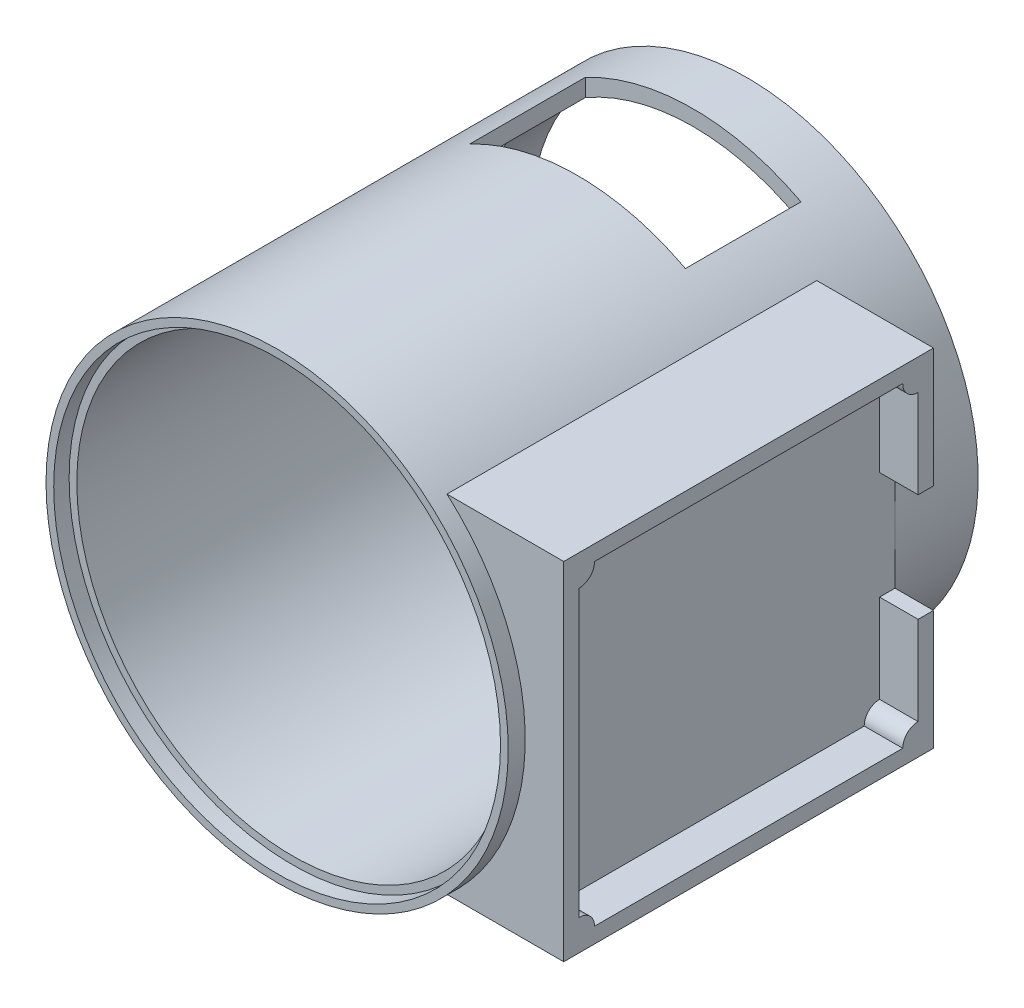
ISO-10303-21;
HEADER;
FILE_DESCRIPTION(('STEP AP214'),'2;1');
FILE_NAME('part.step','',(''),(''),'','','');
FILE_SCHEMA(('AUTOMOTIVE_DESIGN { 1 0 10303 214 1 1 1 1 }'));
ENDSEC;
DATA;
#1=APPLICATION_CONTEXT('core data for automotive mechanical design processes');
#2=APPLICATION_PROTOCOL_DEFINITION('international standard','automotive_design',2000,#1);
#3=PRODUCT_CONTEXT('',#1,'mechanical');
#4=PRODUCT('Part','Part','',(#3));
#5=PRODUCT_RELATED_PRODUCT_CATEGORY('part','',(#4));
#6=PRODUCT_DEFINITION_FORMATION('','',#4);
#7=PRODUCT_DEFINITION_CONTEXT('part definition',#1,'design');
#8=PRODUCT_DEFINITION('design','',#6,#7);
#9=PRODUCT_DEFINITION_SHAPE('','',#8);
#10=(LENGTH_UNIT() NAMED_UNIT(*) SI_UNIT(.MILLI.,.METRE.));
#11=(NAMED_UNIT(*) PLANE_ANGLE_UNIT() SI_UNIT($,.RADIAN.));
#12=(NAMED_UNIT(*) SI_UNIT($,.STERADIAN.) SOLID_ANGLE_UNIT());
#13=UNCERTAINTY_MEASURE_WITH_UNIT(LENGTH_MEASURE(1.E-05),#10,'distance_accuracy_value','');
#14=(GEOMETRIC_REPRESENTATION_CONTEXT(3) GLOBAL_UNCERTAINTY_ASSIGNED_CONTEXT((#13)) GLOBAL_UNIT_ASSIGNED_CONTEXT((#10,
#11,#12)) REPRESENTATION_CONTEXT('',''));
#15=CARTESIAN_POINT('',(0.,0.,0.));
#16=DIRECTION('',(0.,0.,1.));
#17=DIRECTION('',(1.,0.,0.));
#18=AXIS2_PLACEMENT_3D('',#15,#16,#17);
#19=CARTESIAN_POINT('',(30.,0.,0.));
#20=DIRECTION('',(1.,0.,0.));
#21=DIRECTION('',(0.,0.,-1.));
#22=AXIS2_PLACEMENT_3D('',#19,#20,#21);
#23=PLANE('',#22);
#24=DIRECTION('',(0.,-1.,0.));
#25=VECTOR('',#24,1.);
#26=CARTESIAN_POINT('',(30.,-6.99999999999999,5.794078809027));
#27=LINE('',#26,#25);
#28=CARTESIAN_POINT('',(30.,-6.99999999999999,5.794078809027));
#29=VERTEX_POINT('',#28);
#30=CARTESIAN_POINT('',(30.,-18.5,5.794078809027));
#31=VERTEX_POINT('',#30);
#32=EDGE_CURVE('E56',#29,#31,#27,.T.);
#33=ORIENTED_EDGE('',*,*,#32,.F.);
#34=DIRECTION('',(0.,0.,1.));
#35=VECTOR('',#34,1.);
#36=CARTESIAN_POINT('',(30.,-6.99999999999999,3.794078809027));
#37=LINE('',#36,#35);
#38=CARTESIAN_POINT('',(30.,-6.99999999999999,3.794078809027));
#39=VERTEX_POINT('',#38);
#40=EDGE_CURVE('E285',#39,#29,#37,.T.);
#41=ORIENTED_EDGE('',*,*,#40,.F.);
#42=DIRECTION('',(0.,1.,0.));
#43=VECTOR('',#42,1.);
#44=CARTESIAN_POINT('',(30.,22.5,3.794078809027));
#45=LINE('',#44,#43);
#46=CARTESIAN_POINT('',(30.,0.,3.794078809027));
#47=VERTEX_POINT('',#46);
#48=EDGE_CURVE('E237',#39,#47,#45,.T.);
#49=ORIENTED_EDGE('',*,*,#48,.T.);
#50=DIRECTION('',(0.,1.,0.));
#51=VECTOR('',#50,1.);
#52=CARTESIAN_POINT('',(30.,22.5,3.794078809027));
#53=LINE('',#52,#51);
#54=CARTESIAN_POINT('',(30.,7.00000000000001,3.794078809027));
#55=VERTEX_POINT('',#54);
#56=EDGE_CURVE('E400',#47,#55,#53,.T.);
#57=ORIENTED_EDGE('',*,*,#56,.T.);
#58=DIRECTION('',(0.,0.,-1.));
#59=VECTOR('',#58,1.);
#60=CARTESIAN_POINT('',(30.,7.00000000000001,3.794078809027));
#61=LINE('',#60,#59);
#62=CARTESIAN_POINT('',(30.,7.00000000000001,5.794078809027));
#63=VERTEX_POINT('',#62);
#64=EDGE_CURVE('E252',#63,#55,#61,.T.);
#65=ORIENTED_EDGE('',*,*,#64,.F.);
#66=DIRECTION('',(0.,-1.,0.));
#67=VECTOR('',#66,1.);
#68=CARTESIAN_POINT('',(30.,18.5,5.794078809027));
#69=LINE('',#68,#67);
#70=CARTESIAN_POINT('',(30.,18.5,5.794078809027));
#71=VERTEX_POINT('',#70);
#72=EDGE_CURVE('E255',#71,#63,#69,.T.);
#73=ORIENTED_EDGE('',*,*,#72,.F.);
#74=CARTESIAN_POINT('',(30.,20.5,5.794078809027));
#75=DIRECTION('',(1.,0.,0.));
#76=DIRECTION('',(0.,0.,-1.));
#77=AXIS2_PLACEMENT_3D('',#74,#75,#76);
#78=CIRCLE('',#77,1.99999999999999);
#79=CARTESIAN_POINT('',(30.,20.5,7.79407880902699));
#80=VERTEX_POINT('',#79);
#81=EDGE_CURVE('E304',#80,#71,#78,.T.);
#82=ORIENTED_EDGE('',*,*,#81,.F.);
#83=DIRECTION('',(0.,0.,-1.));
#84=VECTOR('',#83,1.);
#85=CARTESIAN_POINT('',(30.,20.5,47.794078809027));
#86=LINE('',#85,#84);
#87=CARTESIAN_POINT('',(30.,20.5,47.794078809027));
#88=VERTEX_POINT('',#87);
#89=EDGE_CURVE('E301',#88,#80,#86,.T.);
#90=ORIENTED_EDGE('',*,*,#89,.F.);
#91=CARTESIAN_POINT('',(30.,20.5,49.794078809027));
#92=DIRECTION('',(1.,0.,0.));
#93=DIRECTION('',(0.,0.,-1.));
#94=AXIS2_PLACEMENT_3D('',#91,#92,#93);
#95=CIRCLE('',#94,2.);
#96=CARTESIAN_POINT('',(30.,18.5,49.794078809027));
#97=VERTEX_POINT('',#96);
#98=EDGE_CURVE('E298',#97,#88,#95,.T.);
#99=ORIENTED_EDGE('',*,*,#98,.F.);
#100=DIRECTION('',(0.,1.,0.));
#101=VECTOR('',#100,1.);
#102=CARTESIAN_POINT('',(30.,18.5,49.794078809027));
#103=LINE('',#102,#101);
#104=CARTESIAN_POINT('',(30.,-18.5,49.794078809027));
#105=VERTEX_POINT('',#104);
#106=EDGE_CURVE('E295',#105,#97,#103,.T.);
#107=ORIENTED_EDGE('',*,*,#106,.F.);
#108=CARTESIAN_POINT('',(30.,-20.5,49.794078809027));
#109=DIRECTION('',(1.,0.,0.));
#110=DIRECTION('',(0.,0.,-1.));
#111=AXIS2_PLACEMENT_3D('',#108,#109,#110);
#112=CIRCLE('',#111,2.00000000000001);
#113=CARTESIAN_POINT('',(30.,-20.5,47.794078809027));
#114=VERTEX_POINT('',#113);
#115=EDGE_CURVE('E292',#114,#105,#112,.T.);
#116=ORIENTED_EDGE('',*,*,#115,.F.);
#117=DIRECTION('',(0.,0.,1.));
#118=VECTOR('',#117,1.);
#119=CARTESIAN_POINT('',(30.,-20.5,47.794078809027));
#120=LINE('',#119,#118);
#121=CARTESIAN_POINT('',(30.,-20.5,7.79407880902699));
#122=VERTEX_POINT('',#121);
#123=EDGE_CURVE('E289',#122,#114,#120,.T.);
#124=ORIENTED_EDGE('',*,*,#123,.F.);
#125=CARTESIAN_POINT('',(30.,-20.5,5.794078809027));
#126=DIRECTION('',(1.,0.,0.));
#127=DIRECTION('',(0.,0.,-1.));
#128=AXIS2_PLACEMENT_3D('',#125,#126,#127);
#129=CIRCLE('',#128,2.);
#130=EDGE_CURVE('E61',#31,#122,#129,.T.);
#131=ORIENTED_EDGE('',*,*,#130,.F.);
#132=EDGE_LOOP('',(#33,#41,#49,#57,#65,#73,#82,#90,#99,#107,#116,#124,#131));
#133=FACE_BOUND('',#132,.T.);
#134=ADVANCED_FACE('F41',(#133),#23,.T.);
#135=CARTESIAN_POINT('',(0.,0.,2.));
#136=DIRECTION('',(0.,0.,-1.));
#137=DIRECTION('',(-1.,0.,0.));
#138=AXIS2_PLACEMENT_3D('',#135,#136,#137);
#139=CYLINDRICAL_SURFACE('',#138,28.);
#140=DIRECTION('',(0.,0.,-1.));
#141=VECTOR('',#140,1.);
#142=CARTESIAN_POINT('',(-24.2487113059643,-13.9999999999999,2.));
#143=LINE('',#142,#141);
#144=CARTESIAN_POINT('',(-24.2487113059643,-13.9999999999999,15.));
#145=VERTEX_POINT('',#144);
#146=CARTESIAN_POINT('',(-24.2487113059643,-13.9999999999999,0.));
#147=VERTEX_POINT('',#146);
#148=EDGE_CURVE('E378',#145,#147,#143,.T.);
#149=ORIENTED_EDGE('',*,*,#148,.F.);
#150=CARTESIAN_POINT('',(0.,0.,15.));
#151=DIRECTION('',(0.,0.,1.));
#152=DIRECTION('',(0.,-1.,0.));
#153=AXIS2_PLACEMENT_3D('',#150,#151,#152);
#154=CIRCLE('',#153,28.);
#155=CARTESIAN_POINT('',(-24.2487113059642,14.0000000000001,15.));
#156=VERTEX_POINT('',#155);
#157=EDGE_CURVE('E375',#156,#145,#154,.T.);
#158=ORIENTED_EDGE('',*,*,#157,.F.);
#159=DIRECTION('',(0.,0.,-1.));
#160=VECTOR('',#159,1.);
#161=CARTESIAN_POINT('',(-24.2487113059642,14.0000000000001,2.));
#162=LINE('',#161,#160);
#163=CARTESIAN_POINT('',(-24.2487113059642,14.0000000000001,0.));
#164=VERTEX_POINT('',#163);
#165=EDGE_CURVE('E373',#164,#156,#162,.F.);
#166=ORIENTED_EDGE('',*,*,#165,.F.);
#167=CARTESIAN_POINT('',(0.,0.,0.));
#168=DIRECTION('',(0.,0.,-1.));
#169=DIRECTION('',(-1.,0.,0.));
#170=AXIS2_PLACEMENT_3D('',#167,#168,#169);
#171=CIRCLE('',#170,28.);
#172=EDGE_CURVE('E370',#147,#164,#171,.T.);
#173=ORIENTED_EDGE('',*,*,#172,.F.);
#174=EDGE_LOOP('',(#149,#158,#166,#173));
#175=FACE_BOUND('',#174,.T.);
#176=DIRECTION('',(0.,0.,-1.));
#177=VECTOR('',#176,1.);
#178=CARTESIAN_POINT('',(-14.,24.2487113059643,2.));
#179=LINE('',#178,#177);
#180=CARTESIAN_POINT('',(-14.,24.2487113059643,15.));
#181=VERTEX_POINT('',#180);
#182=CARTESIAN_POINT('',(-14.,24.2487113059643,0.));
#183=VERTEX_POINT('',#182);
#184=EDGE_CURVE('E368',#181,#183,#179,.T.);
#185=ORIENTED_EDGE('',*,*,#184,.F.);
#186=CARTESIAN_POINT('',(14.,24.2487113059643,15.));
#187=VERTEX_POINT('',#186);
#188=EDGE_CURVE('E377',#187,#181,#154,.T.);
#189=ORIENTED_EDGE('',*,*,#188,.F.);
#190=DIRECTION('',(0.,0.,-1.));
#191=VECTOR('',#190,1.);
#192=CARTESIAN_POINT('',(14.,24.2487113059643,2.));
#193=LINE('',#192,#191);
#194=CARTESIAN_POINT('',(14.,24.2487113059643,0.));
#195=VERTEX_POINT('',#194);
#196=EDGE_CURVE('E359',#195,#187,#193,.F.);
#197=ORIENTED_EDGE('',*,*,#196,.F.);
#198=EDGE_CURVE('E372',#183,#195,#171,.T.);
#199=ORIENTED_EDGE('',*,*,#198,.F.);
#200=EDGE_LOOP('',(#185,#189,#197,#199));
#201=FACE_BOUND('',#200,.T.);
#202=DIRECTION('',(0.,0.,-1.));
#203=VECTOR('',#202,1.);
#204=CARTESIAN_POINT('',(14.,-24.2487113059643,2.));
#205=LINE('',#204,#203);
#206=CARTESIAN_POINT('',(14.,-24.2487113059643,15.));
#207=VERTEX_POINT('',#206);
#208=CARTESIAN_POINT('',(14.,-24.2487113059643,0.));
#209=VERTEX_POINT('',#208);
#210=EDGE_CURVE('E398',#207,#209,#205,.T.);
#211=ORIENTED_EDGE('',*,*,#210,.F.);
#212=CARTESIAN_POINT('',(0.,0.,15.));
#213=DIRECTION('',(0.,0.,1.));
#214=DIRECTION('',(1.,0.,0.));
#215=AXIS2_PLACEMENT_3D('',#212,#213,#214);
#216=CIRCLE('',#215,28.);
#217=CARTESIAN_POINT('',(-14.,-24.2487113059643,15.));
#218=VERTEX_POINT('',#217);
#219=EDGE_CURVE('E396',#218,#207,#216,.T.);
#220=ORIENTED_EDGE('',*,*,#219,.F.);
#221=DIRECTION('',(0.,0.,-1.));
#222=VECTOR('',#221,1.);
#223=CARTESIAN_POINT('',(-14.,-24.2487113059643,2.));
#224=LINE('',#223,#222);
#225=CARTESIAN_POINT('',(-14.,-24.2487113059643,0.));
#226=VERTEX_POINT('',#225);
#227=EDGE_CURVE('E394',#226,#218,#224,.F.);
#228=ORIENTED_EDGE('',*,*,#227,.F.);
#229=CARTESIAN_POINT('',(0.,0.,0.));
#230=DIRECTION('',(0.,0.,-1.));
#231=DIRECTION('',(-1.,0.,0.));
#232=AXIS2_PLACEMENT_3D('',#229,#230,#231);
#233=CIRCLE('',#232,28.);
#234=EDGE_CURVE('E385',#209,#226,#233,.T.);
#235=ORIENTED_EDGE('',*,*,#234,.F.);
#236=EDGE_LOOP('',(#211,#220,#228,#235));
#237=FACE_BOUND('',#236,.T.);
#238=CARTESIAN_POINT('',(0.,0.,52.));
#239=DIRECTION('',(0.,0.,1.));
#240=DIRECTION('',(1.,0.,0.));
#241=AXIS2_PLACEMENT_3D('',#238,#239,#240);
#242=CIRCLE('',#241,28.);
#243=CARTESIAN_POINT('',(28.,0.,52.));
#244=VERTEX_POINT('',#243);
#245=EDGE_CURVE('E426',#244,#244,#242,.T.);
#246=ORIENTED_EDGE('',*,*,#245,.T.);
#247=EDGE_LOOP('',(#246));
#248=FACE_BOUND('',#247,.T.);
#249=CARTESIAN_POINT('',(0.,0.,-7.));
#250=DIRECTION('',(0.,0.,-1.));
#251=DIRECTION('',(-1.,0.,0.));
#252=AXIS2_PLACEMENT_3D('',#249,#250,#251);
#253=CIRCLE('',#252,28.);
#254=CARTESIAN_POINT('',(-28.,0.,-7.));
#255=VERTEX_POINT('',#254);
#256=EDGE_CURVE('E414',#255,#255,#253,.T.);
#257=ORIENTED_EDGE('',*,*,#256,.T.);
#258=EDGE_LOOP('',(#257));
#259=FACE_BOUND('',#258,.T.);
#260=ADVANCED_FACE('F479',(#175,#201,#237,#248,#259),#139,.F.);
#261=CARTESIAN_POINT('',(0.,0.,2.));
#262=DIRECTION('',(0.,0.,-1.));
#263=DIRECTION('',(-1.,0.,0.));
#264=AXIS2_PLACEMENT_3D('',#261,#262,#263);
#265=CYLINDRICAL_SURFACE('',#264,30.);
#266=DIRECTION('',(0.,0.,-1.));
#267=VECTOR('',#266,1.);
#268=CARTESIAN_POINT('',(-26.5329983228431,14.0000000000001,2.));
#269=LINE('',#268,#267);
#270=CARTESIAN_POINT('',(-26.5329983228431,14.0000000000001,0.));
#271=VERTEX_POINT('',#270);
#272=CARTESIAN_POINT('',(-26.5329983228431,14.0000000000001,15.));
#273=VERTEX_POINT('',#272);
#274=EDGE_CURVE('E11',#271,#273,#269,.F.);
#275=ORIENTED_EDGE('',*,*,#274,.T.);
#276=CARTESIAN_POINT('',(0.,0.,15.));
#277=DIRECTION('',(0.,0.,1.));
#278=DIRECTION('',(0.,-1.,0.));
#279=AXIS2_PLACEMENT_3D('',#276,#277,#278);
#280=CIRCLE('',#279,30.);
#281=CARTESIAN_POINT('',(-26.5329983228432,-13.9999999999999,15.));
#282=VERTEX_POINT('',#281);
#283=EDGE_CURVE('E458',#273,#282,#280,.T.);
#284=ORIENTED_EDGE('',*,*,#283,.T.);
#285=DIRECTION('',(0.,0.,-1.));
#286=VECTOR('',#285,1.);
#287=CARTESIAN_POINT('',(-26.5329983228432,-13.9999999999999,2.));
#288=LINE('',#287,#286);
#289=CARTESIAN_POINT('',(-26.5329983228432,-13.9999999999999,0.));
#290=VERTEX_POINT('',#289);
#291=EDGE_CURVE('E49',#282,#290,#288,.T.);
#292=ORIENTED_EDGE('',*,*,#291,.T.);
#293=CARTESIAN_POINT('',(0.,0.,0.));
#294=DIRECTION('',(0.,0.,-1.));
#295=DIRECTION('',(-1.,0.,0.));
#296=AXIS2_PLACEMENT_3D('',#293,#294,#295);
#297=CIRCLE('',#296,30.);
#298=EDGE_CURVE('E454',#290,#271,#297,.T.);
#299=ORIENTED_EDGE('',*,*,#298,.T.);
#300=EDGE_LOOP('',(#275,#284,#292,#299));
#301=FACE_BOUND('',#300,.T.);
#302=DIRECTION('',(0.,0.,-1.));
#303=VECTOR('',#302,1.);
#304=CARTESIAN_POINT('',(14.,26.5329983228432,2.));
#305=LINE('',#304,#303);
#306=CARTESIAN_POINT('',(14.,26.5329983228432,0.));
#307=VERTEX_POINT('',#306);
#308=CARTESIAN_POINT('',(14.,26.5329983228432,15.));
#309=VERTEX_POINT('',#308);
#310=EDGE_CURVE('E457',#307,#309,#305,.F.);
#311=ORIENTED_EDGE('',*,*,#310,.T.);
#312=CARTESIAN_POINT('',(-14.,26.5329983228432,15.));
#313=VERTEX_POINT('',#312);
#314=EDGE_CURVE('E453',#309,#313,#280,.T.);
#315=ORIENTED_EDGE('',*,*,#314,.T.);
#316=DIRECTION('',(0.,0.,-1.));
#317=VECTOR('',#316,1.);
#318=CARTESIAN_POINT('',(-14.,26.5329983228432,2.));
#319=LINE('',#318,#317);
#320=CARTESIAN_POINT('',(-14.,26.5329983228432,0.));
#321=VERTEX_POINT('',#320);
#322=EDGE_CURVE('E461',#313,#321,#319,.T.);
#323=ORIENTED_EDGE('',*,*,#322,.T.);
#324=EDGE_CURVE('E450',#321,#307,#297,.T.);
#325=ORIENTED_EDGE('',*,*,#324,.T.);
#326=EDGE_LOOP('',(#311,#315,#323,#325));
#327=FACE_BOUND('',#326,.T.);
#328=DIRECTION('',(0.,0.,-1.));
#329=VECTOR('',#328,1.);
#330=CARTESIAN_POINT('',(14.,-26.5329983228432,2.));
#331=LINE('',#330,#329);
#332=CARTESIAN_POINT('',(14.,-26.5329983228432,15.));
#333=VERTEX_POINT('',#332);
#334=CARTESIAN_POINT('',(14.,-26.5329983228432,0.));
#335=VERTEX_POINT('',#334);
#336=EDGE_CURVE('E447',#333,#335,#331,.T.);
#337=ORIENTED_EDGE('',*,*,#336,.T.);
#338=CARTESIAN_POINT('',(0.,0.,0.));
#339=DIRECTION('',(0.,0.,-1.));
#340=DIRECTION('',(-1.,0.,0.));
#341=AXIS2_PLACEMENT_3D('',#338,#339,#340);
#342=CIRCLE('',#341,30.);
#343=CARTESIAN_POINT('',(-14.,-26.5329983228432,0.));
#344=VERTEX_POINT('',#343);
#345=EDGE_CURVE('E438',#335,#344,#342,.T.);
#346=ORIENTED_EDGE('',*,*,#345,.T.);
#347=DIRECTION('',(0.,0.,-1.));
#348=VECTOR('',#347,1.);
#349=CARTESIAN_POINT('',(-14.,-26.5329983228432,2.));
#350=LINE('',#349,#348);
#351=CARTESIAN_POINT('',(-14.,-26.5329983228432,15.));
#352=VERTEX_POINT('',#351);
#353=EDGE_CURVE('E441',#344,#352,#350,.F.);
#354=ORIENTED_EDGE('',*,*,#353,.T.);
#355=CARTESIAN_POINT('',(0.,0.,15.));
#356=DIRECTION('',(0.,0.,1.));
#357=DIRECTION('',(1.,0.,0.));
#358=AXIS2_PLACEMENT_3D('',#355,#356,#357);
#359=CIRCLE('',#358,30.);
#360=EDGE_CURVE('E444',#352,#333,#359,.T.);
#361=ORIENTED_EDGE('',*,*,#360,.T.);
#362=EDGE_LOOP('',(#337,#346,#354,#361));
#363=FACE_BOUND('',#362,.T.);
#364=CARTESIAN_POINT('',(0.,0.,51.794078809027));
#365=DIRECTION('',(0.,0.,1.));
#366=DIRECTION('',(0.,-1.,0.));
#367=AXIS2_PLACEMENT_3D('',#364,#365,#366);
#368=CIRCLE('',#367,30.);
#369=CARTESIAN_POINT('',(19.8431348329844,22.5,51.794078809027));
#370=VERTEX_POINT('',#369);
#371=CARTESIAN_POINT('',(19.8431348329844,-22.5,51.794078809027));
#372=VERTEX_POINT('',#371);
#373=EDGE_CURVE('E410',#370,#372,#368,.F.);
#374=ORIENTED_EDGE('',*,*,#373,.F.);
#375=DIRECTION('',(0.,0.,-1.));
#376=VECTOR('',#375,1.);
#377=CARTESIAN_POINT('',(19.8431348329844,22.5,2.));
#378=LINE('',#377,#376);
#379=CARTESIAN_POINT('',(19.8431348329844,22.5,3.794078809027));
#380=VERTEX_POINT('',#379);
#381=EDGE_CURVE('E234',#380,#370,#378,.F.);
#382=ORIENTED_EDGE('',*,*,#381,.F.);
#383=CARTESIAN_POINT('',(0.,0.,3.794078809027));
#384=DIRECTION('',(0.,0.,-1.));
#385=DIRECTION('',(0.,1.,0.));
#386=AXIS2_PLACEMENT_3D('',#383,#384,#385);
#387=CIRCLE('',#386,30.);
#388=EDGE_CURVE('E404',#47,#380,#387,.F.);
#389=ORIENTED_EDGE('',*,*,#388,.F.);
#390=CARTESIAN_POINT('',(0.,0.,3.794078809027));
#391=DIRECTION('',(0.,0.,-1.));
#392=DIRECTION('',(0.,1.,0.));
#393=AXIS2_PLACEMENT_3D('',#390,#391,#392);
#394=CIRCLE('',#393,30.);
#395=CARTESIAN_POINT('',(19.8431348329844,-22.5,3.794078809027));
#396=VERTEX_POINT('',#395);
#397=EDGE_CURVE('E411',#396,#47,#394,.F.);
#398=ORIENTED_EDGE('',*,*,#397,.F.);
#399=DIRECTION('',(0.,0.,-1.));
#400=VECTOR('',#399,1.);
#401=CARTESIAN_POINT('',(19.8431348329844,-22.5,2.));
#402=LINE('',#401,#400);
#403=EDGE_CURVE('E417',#372,#396,#402,.T.);
#404=ORIENTED_EDGE('',*,*,#403,.F.);
#405=EDGE_LOOP('',(#374,#382,#389,#398,#404));
#406=FACE_BOUND('',#405,.T.);
#407=CARTESIAN_POINT('',(0.,0.,54.));
#408=DIRECTION('',(0.,0.,1.));
#409=DIRECTION('',(1.,0.,0.));
#410=AXIS2_PLACEMENT_3D('',#407,#408,#409);
#411=CIRCLE('',#410,30.);
#412=CARTESIAN_POINT('',(30.,0.,54.));
#413=VERTEX_POINT('',#412);
#414=EDGE_CURVE('E433',#413,#413,#411,.T.);
#415=ORIENTED_EDGE('',*,*,#414,.F.);
#416=EDGE_LOOP('',(#415));
#417=FACE_BOUND('',#416,.T.);
#418=CARTESIAN_POINT('',(0.,0.,-7.));
#419=DIRECTION('',(0.,0.,-1.));
#420=DIRECTION('',(-1.,0.,0.));
#421=AXIS2_PLACEMENT_3D('',#418,#419,#420);
#422=CIRCLE('',#421,30.);
#423=CARTESIAN_POINT('',(-30.,0.,-7.));
#424=VERTEX_POINT('',#423);
#425=EDGE_CURVE('E423',#424,#424,#422,.T.);
#426=ORIENTED_EDGE('',*,*,#425,.F.);
#427=EDGE_LOOP('',(#426));
#428=FACE_BOUND('',#427,.T.);
#429=ADVANCED_FACE('F43',(#301,#327,#363,#406,#417,#428),#265,.T.);
#430=CARTESIAN_POINT('',(0.,0.,54.));
#431=DIRECTION('',(0.,0.,1.));
#432=DIRECTION('',(1.,0.,0.));
#433=AXIS2_PLACEMENT_3D('',#430,#431,#432);
#434=PLANE('',#433);
#435=CARTESIAN_POINT('',(0.,0.,54.));
#436=DIRECTION('',(0.,0.,1.));
#437=DIRECTION('',(1.,0.,0.));
#438=AXIS2_PLACEMENT_3D('',#435,#436,#437);
#439=CIRCLE('',#438,29.);
#440=CARTESIAN_POINT('',(29.,0.,54.));
#441=VERTEX_POINT('',#440);
#442=EDGE_CURVE('E429',#441,#441,#439,.T.);
#443=ORIENTED_EDGE('',*,*,#442,.F.);
#444=EDGE_LOOP('',(#443));
#445=FACE_BOUND('',#444,.T.);
#446=ORIENTED_EDGE('',*,*,#414,.T.);
#447=EDGE_LOOP('',(#446));
#448=FACE_BOUND('',#447,.T.);
#449=ADVANCED_FACE('F531',(#445,#448),#434,.T.);
#450=CARTESIAN_POINT('',(0.,0.,52.));
#451=DIRECTION('',(0.,0.,1.));
#452=DIRECTION('',(1.,0.,0.));
#453=AXIS2_PLACEMENT_3D('',#450,#451,#452);
#454=CYLINDRICAL_SURFACE('',#453,29.);
#455=CARTESIAN_POINT('',(0.,0.,52.));
#456=DIRECTION('',(0.,0.,1.));
#457=DIRECTION('',(1.,0.,0.));
#458=AXIS2_PLACEMENT_3D('',#455,#456,#457);
#459=CIRCLE('',#458,29.);
#460=CARTESIAN_POINT('',(29.,0.,52.));
#461=VERTEX_POINT('',#460);
#462=EDGE_CURVE('E430',#461,#461,#459,.T.);
#463=ORIENTED_EDGE('',*,*,#462,.F.);
#464=EDGE_LOOP('',(#463));
#465=FACE_BOUND('',#464,.T.);
#466=ORIENTED_EDGE('',*,*,#442,.T.);
#467=EDGE_LOOP('',(#466));
#468=FACE_BOUND('',#467,.T.);
#469=ADVANCED_FACE('F527',(#465,#468),#454,.F.);
#470=CARTESIAN_POINT('',(0.,0.,52.));
#471=DIRECTION('',(0.,0.,1.));
#472=DIRECTION('',(1.,0.,0.));
#473=AXIS2_PLACEMENT_3D('',#470,#471,#472);
#474=PLANE('',#473);
#475=ORIENTED_EDGE('',*,*,#245,.F.);
#476=EDGE_LOOP('',(#475));
#477=FACE_BOUND('',#476,.T.);
#478=ORIENTED_EDGE('',*,*,#462,.T.);
#479=EDGE_LOOP('',(#478));
#480=FACE_BOUND('',#479,.T.);
#481=ADVANCED_FACE('F523',(#477,#480),#474,.T.);
#482=CARTESIAN_POINT('',(0.,0.,-7.));
#483=DIRECTION('',(0.,0.,-1.));
#484=DIRECTION('',(-1.,0.,0.));
#485=AXIS2_PLACEMENT_3D('',#482,#483,#484);
#486=PLANE('',#485);
#487=ORIENTED_EDGE('',*,*,#425,.T.);
#488=EDGE_LOOP('',(#487));
#489=FACE_BOUND('',#488,.T.);
#490=ORIENTED_EDGE('',*,*,#256,.F.);
#491=EDGE_LOOP('',(#490));
#492=FACE_BOUND('',#491,.T.);
#493=ADVANCED_FACE('F513',(#489,#492),#486,.T.);
#494=CARTESIAN_POINT('',(-30.001,22.5,51.794078809027));
#495=DIRECTION('',(0.,0.,1.));
#496=DIRECTION('',(0.,-1.,0.));
#497=AXIS2_PLACEMENT_3D('',#494,#495,#496);
#498=PLANE('',#497);
#499=DIRECTION('',(1.,0.,0.));
#500=VECTOR('',#499,1.);
#501=CARTESIAN_POINT('',(-30.001,-22.5,51.794078809027));
#502=LINE('',#501,#500);
#503=CARTESIAN_POINT('',(35.,-22.5,51.794078809027));
#504=VERTEX_POINT('',#503);
#505=EDGE_CURVE('E242',#372,#504,#502,.T.);
#506=ORIENTED_EDGE('',*,*,#505,.T.);
#507=DIRECTION('',(0.,-1.,0.));
#508=VECTOR('',#507,1.);
#509=CARTESIAN_POINT('',(35.,22.5,51.794078809027));
#510=LINE('',#509,#508);
#511=CARTESIAN_POINT('',(35.,22.5,51.794078809027));
#512=VERTEX_POINT('',#511);
#513=EDGE_CURVE('E240',#512,#504,#510,.T.);
#514=ORIENTED_EDGE('',*,*,#513,.F.);
#515=DIRECTION('',(1.,0.,0.));
#516=VECTOR('',#515,1.);
#517=CARTESIAN_POINT('',(-30.001,22.5,51.794078809027));
#518=LINE('',#517,#516);
#519=EDGE_CURVE('E228',#370,#512,#518,.T.);
#520=ORIENTED_EDGE('',*,*,#519,.F.);
#521=ORIENTED_EDGE('',*,*,#373,.T.);
#522=EDGE_LOOP('',(#506,#514,#520,#521));
#523=FACE_BOUND('',#522,.T.);
#524=ADVANCED_FACE('F241',(#523),#498,.T.);
#525=CARTESIAN_POINT('',(-30.001,-22.5,51.794078809027));
#526=DIRECTION('',(0.,-1.,0.));
#527=DIRECTION('',(0.,0.,-1.));
#528=AXIS2_PLACEMENT_3D('',#525,#526,#527);
#529=PLANE('',#528);
#530=ORIENTED_EDGE('',*,*,#505,.F.);
#531=ORIENTED_EDGE('',*,*,#403,.T.);
#532=DIRECTION('',(1.,0.,0.));
#533=VECTOR('',#532,1.);
#534=CARTESIAN_POINT('',(-30.001,-22.5,3.794078809027));
#535=LINE('',#534,#533);
#536=CARTESIAN_POINT('',(35.,-22.5,3.794078809027));
#537=VERTEX_POINT('',#536);
#538=EDGE_CURVE('E415',#396,#537,#535,.T.);
#539=ORIENTED_EDGE('',*,*,#538,.T.);
#540=DIRECTION('',(0.,0.,-1.));
#541=VECTOR('',#540,1.);
#542=CARTESIAN_POINT('',(35.,-22.5,51.794078809027));
#543=LINE('',#542,#541);
#544=EDGE_CURVE('E246',#504,#537,#543,.T.);
#545=ORIENTED_EDGE('',*,*,#544,.F.);
#546=EDGE_LOOP('',(#530,#531,#539,#545));
#547=FACE_BOUND('',#546,.T.);
#548=ADVANCED_FACE('F512',(#547),#529,.T.);
#549=CARTESIAN_POINT('',(-30.001,22.5,3.794078809027));
#550=DIRECTION('',(0.,0.,-1.));
#551=DIRECTION('',(0.,1.,0.));
#552=AXIS2_PLACEMENT_3D('',#549,#550,#551);
#553=PLANE('',#552);
#554=ORIENTED_EDGE('',*,*,#538,.F.);
#555=ORIENTED_EDGE('',*,*,#397,.T.);
#556=ORIENTED_EDGE('',*,*,#48,.F.);
#557=DIRECTION('',(-1.,0.,0.));
#558=VECTOR('',#557,1.);
#559=CARTESIAN_POINT('',(35.,-6.99999999999999,3.794078809027));
#560=LINE('',#559,#558);
#561=CARTESIAN_POINT('',(35.,-6.99999999999999,3.794078809027));
#562=VERTEX_POINT('',#561);
#563=EDGE_CURVE('E341',#562,#39,#560,.T.);
#564=ORIENTED_EDGE('',*,*,#563,.F.);
#565=DIRECTION('',(0.,1.,0.));
#566=VECTOR('',#565,1.);
#567=CARTESIAN_POINT('',(35.,-6.99999999999999,3.794078809027));
#568=LINE('',#567,#566);
#569=EDGE_CURVE('E259',#537,#562,#568,.T.);
#570=ORIENTED_EDGE('',*,*,#569,.F.);
#571=EDGE_LOOP('',(#554,#555,#556,#564,#570));
#572=FACE_BOUND('',#571,.T.);
#573=ADVANCED_FACE('F516',(#572),#553,.T.);
#574=CARTESIAN_POINT('',(-30.001,22.5,3.794078809027));
#575=DIRECTION('',(0.,0.,-1.));
#576=DIRECTION('',(0.,1.,0.));
#577=AXIS2_PLACEMENT_3D('',#574,#575,#576);
#578=PLANE('',#577);
#579=ORIENTED_EDGE('',*,*,#56,.F.);
#580=ORIENTED_EDGE('',*,*,#388,.T.);
#581=DIRECTION('',(1.,0.,0.));
#582=VECTOR('',#581,1.);
#583=CARTESIAN_POINT('',(-30.001,22.5,3.794078809027));
#584=LINE('',#583,#582);
#585=CARTESIAN_POINT('',(35.,22.5,3.794078809027));
#586=VERTEX_POINT('',#585);
#587=EDGE_CURVE('E402',#380,#586,#584,.T.);
#588=ORIENTED_EDGE('',*,*,#587,.T.);
#589=DIRECTION('',(0.,1.,0.));
#590=VECTOR('',#589,1.);
#591=CARTESIAN_POINT('',(35.,22.5,3.794078809027));
#592=LINE('',#591,#590);
#593=CARTESIAN_POINT('',(35.,7.00000000000001,3.794078809027));
#594=VERTEX_POINT('',#593);
#595=EDGE_CURVE('E251',#594,#586,#592,.T.);
#596=ORIENTED_EDGE('',*,*,#595,.F.);
#597=DIRECTION('',(-1.,0.,0.));
#598=VECTOR('',#597,1.);
#599=CARTESIAN_POINT('',(35.,7.00000000000001,3.794078809027));
#600=LINE('',#599,#598);
#601=EDGE_CURVE('E284',#594,#55,#600,.T.);
#602=ORIENTED_EDGE('',*,*,#601,.T.);
#603=EDGE_LOOP('',(#579,#580,#588,#596,#602));
#604=FACE_BOUND('',#603,.T.);
#605=ADVANCED_FACE('F508',(#604),#578,.T.);
#606=CARTESIAN_POINT('',(-30.001,22.5,3.794078809027));
#607=DIRECTION('',(0.,1.,0.));
#608=DIRECTION('',(0.,0.,1.));
#609=AXIS2_PLACEMENT_3D('',#606,#607,#608);
#610=PLANE('',#609);
#611=ORIENTED_EDGE('',*,*,#587,.F.);
#612=ORIENTED_EDGE('',*,*,#381,.T.);
#613=ORIENTED_EDGE('',*,*,#519,.T.);
#614=DIRECTION('',(0.,0.,1.));
#615=VECTOR('',#614,1.);
#616=CARTESIAN_POINT('',(35.,22.5,51.794078809027));
#617=LINE('',#616,#615);
#618=EDGE_CURVE('E232',#586,#512,#617,.T.);
#619=ORIENTED_EDGE('',*,*,#618,.F.);
#620=EDGE_LOOP('',(#611,#612,#613,#619));
#621=FACE_BOUND('',#620,.T.);
#622=ADVANCED_FACE('F230',(#621),#610,.T.);
#623=CARTESIAN_POINT('',(14.,-30.,0.));
#624=DIRECTION('',(1.,0.,0.));
#625=DIRECTION('',(0.,0.,-1.));
#626=AXIS2_PLACEMENT_3D('',#623,#624,#625);
#627=PLANE('',#626);
#628=ORIENTED_EDGE('',*,*,#210,.T.);
#629=DIRECTION('',(0.,1.,0.));
#630=VECTOR('',#629,1.);
#631=CARTESIAN_POINT('',(14.,-30.,0.));
#632=LINE('',#631,#630);
#633=EDGE_CURVE('E381',#335,#209,#632,.T.);
#634=ORIENTED_EDGE('',*,*,#633,.F.);
#635=ORIENTED_EDGE('',*,*,#336,.F.);
#636=DIRECTION('',(0.,1.,0.));
#637=VECTOR('',#636,1.);
#638=CARTESIAN_POINT('',(14.,-30.,15.));
#639=LINE('',#638,#637);
#640=EDGE_CURVE('E382',#333,#207,#639,.T.);
#641=ORIENTED_EDGE('',*,*,#640,.T.);
#642=EDGE_LOOP('',(#628,#634,#635,#641));
#643=FACE_BOUND('',#642,.T.);
#644=ADVANCED_FACE('F581',(#643),#627,.F.);
#645=CARTESIAN_POINT('',(14.,-30.,15.));
#646=DIRECTION('',(0.,0.,1.));
#647=DIRECTION('',(1.,0.,0.));
#648=AXIS2_PLACEMENT_3D('',#645,#646,#647);
#649=PLANE('',#648);
#650=ORIENTED_EDGE('',*,*,#219,.T.);
#651=ORIENTED_EDGE('',*,*,#640,.F.);
#652=ORIENTED_EDGE('',*,*,#360,.F.);
#653=DIRECTION('',(0.,1.,0.));
#654=VECTOR('',#653,1.);
#655=CARTESIAN_POINT('',(-14.,-30.,15.));
#656=LINE('',#655,#654);
#657=EDGE_CURVE('E386',#352,#218,#656,.T.);
#658=ORIENTED_EDGE('',*,*,#657,.T.);
#659=EDGE_LOOP('',(#650,#651,#652,#658));
#660=FACE_BOUND('',#659,.T.);
#661=ADVANCED_FACE('F803',(#660),#649,.F.);
#662=CARTESIAN_POINT('',(-14.,-30.,15.));
#663=DIRECTION('',(-1.,0.,0.));
#664=DIRECTION('',(0.,0.,1.));
#665=AXIS2_PLACEMENT_3D('',#662,#663,#664);
#666=PLANE('',#665);
#667=ORIENTED_EDGE('',*,*,#227,.T.);
#668=ORIENTED_EDGE('',*,*,#657,.F.);
#669=ORIENTED_EDGE('',*,*,#353,.F.);
#670=DIRECTION('',(0.,1.,0.));
#671=VECTOR('',#670,1.);
#672=CARTESIAN_POINT('',(-14.,-30.,0.));
#673=LINE('',#672,#671);
#674=EDGE_CURVE('E389',#344,#226,#673,.T.);
#675=ORIENTED_EDGE('',*,*,#674,.T.);
#676=EDGE_LOOP('',(#667,#668,#669,#675));
#677=FACE_BOUND('',#676,.T.);
#678=ADVANCED_FACE('F795',(#677),#666,.F.);
#679=CARTESIAN_POINT('',(-14.,-30.,0.));
#680=DIRECTION('',(0.,0.,-1.));
#681=DIRECTION('',(-1.,0.,0.));
#682=AXIS2_PLACEMENT_3D('',#679,#680,#681);
#683=PLANE('',#682);
#684=ORIENTED_EDGE('',*,*,#234,.T.);
#685=ORIENTED_EDGE('',*,*,#674,.F.);
#686=ORIENTED_EDGE('',*,*,#345,.F.);
#687=ORIENTED_EDGE('',*,*,#633,.T.);
#688=EDGE_LOOP('',(#684,#685,#686,#687));
#689=FACE_BOUND('',#688,.T.);
#690=ADVANCED_FACE('F781',(#689),#683,.F.);
#691=CARTESIAN_POINT('',(14.,30.,15.));
#692=DIRECTION('',(1.,0.,0.));
#693=DIRECTION('',(0.,0.,-1.));
#694=AXIS2_PLACEMENT_3D('',#691,#692,#693);
#695=PLANE('',#694);
#696=ORIENTED_EDGE('',*,*,#196,.T.);
#697=DIRECTION('',(0.,-1.,0.));
#698=VECTOR('',#697,1.);
#699=CARTESIAN_POINT('',(14.,30.,15.));
#700=LINE('',#699,#698);
#701=EDGE_CURVE('E349',#309,#187,#700,.T.);
#702=ORIENTED_EDGE('',*,*,#701,.F.);
#703=ORIENTED_EDGE('',*,*,#310,.F.);
#704=DIRECTION('',(0.,-1.,0.));
#705=VECTOR('',#704,1.);
#706=CARTESIAN_POINT('',(14.,30.,0.));
#707=LINE('',#706,#705);
#708=EDGE_CURVE('E352',#307,#195,#707,.T.);
#709=ORIENTED_EDGE('',*,*,#708,.T.);
#710=EDGE_LOOP('',(#696,#702,#703,#709));
#711=FACE_BOUND('',#710,.T.);
#712=ADVANCED_FACE('F774',(#711),#695,.F.);
#713=CARTESIAN_POINT('',(-14.,30.,0.));
#714=DIRECTION('',(-1.,0.,0.));
#715=DIRECTION('',(0.,0.,1.));
#716=AXIS2_PLACEMENT_3D('',#713,#714,#715);
#717=PLANE('',#716);
#718=ORIENTED_EDGE('',*,*,#184,.T.);
#719=DIRECTION('',(0.,-1.,0.));
#720=VECTOR('',#719,1.);
#721=CARTESIAN_POINT('',(-14.,30.,0.));
#722=LINE('',#721,#720);
#723=EDGE_CURVE('E344',#321,#183,#722,.T.);
#724=ORIENTED_EDGE('',*,*,#723,.F.);
#725=ORIENTED_EDGE('',*,*,#322,.F.);
#726=DIRECTION('',(0.,-1.,0.));
#727=VECTOR('',#726,1.);
#728=CARTESIAN_POINT('',(-14.,30.,15.));
#729=LINE('',#728,#727);
#730=EDGE_CURVE('E345',#313,#181,#729,.T.);
#731=ORIENTED_EDGE('',*,*,#730,.T.);
#732=EDGE_LOOP('',(#718,#724,#725,#731));
#733=FACE_BOUND('',#732,.T.);
#734=ADVANCED_FACE('F766',(#733),#717,.F.);
#735=CARTESIAN_POINT('',(-30.0000000000001,14.0000000000001,0.));
#736=DIRECTION('',(0.,0.,-1.));
#737=DIRECTION('',(-1.,0.,0.));
#738=AXIS2_PLACEMENT_3D('',#735,#736,#737);
#739=PLANE('',#738);
#740=ORIENTED_EDGE('',*,*,#198,.T.);
#741=ORIENTED_EDGE('',*,*,#708,.F.);
#742=ORIENTED_EDGE('',*,*,#324,.F.);
#743=ORIENTED_EDGE('',*,*,#723,.T.);
#744=EDGE_LOOP('',(#740,#741,#742,#743));
#745=FACE_BOUND('',#744,.T.);
#746=ADVANCED_FACE('F495',(#745),#739,.F.);
#747=CARTESIAN_POINT('',(-30.0000000000002,-13.9999999999999,15.));
#748=DIRECTION('',(0.,0.,1.));
#749=DIRECTION('',(0.,-1.,0.));
#750=AXIS2_PLACEMENT_3D('',#747,#748,#749);
#751=PLANE('',#750);
#752=ORIENTED_EDGE('',*,*,#188,.T.);
#753=ORIENTED_EDGE('',*,*,#730,.F.);
#754=ORIENTED_EDGE('',*,*,#314,.F.);
#755=ORIENTED_EDGE('',*,*,#701,.T.);
#756=EDGE_LOOP('',(#752,#753,#754,#755));
#757=FACE_BOUND('',#756,.T.);
#758=ADVANCED_FACE('F488',(#757),#751,.F.);
#759=CARTESIAN_POINT('',(-30.0000000000002,-13.9999999999999,0.));
#760=DIRECTION('',(0.,-1.,0.));
#761=DIRECTION('',(1.,0.,0.));
#762=AXIS2_PLACEMENT_3D('',#759,#760,#761);
#763=PLANE('',#762);
#764=ORIENTED_EDGE('',*,*,#148,.T.);
#765=DIRECTION('',(1.,0.,0.));
#766=VECTOR('',#765,1.);
#767=CARTESIAN_POINT('',(-30.0000000000002,-13.9999999999999,0.));
#768=LINE('',#767,#766);
#769=EDGE_CURVE('E348',#290,#147,#768,.T.);
#770=ORIENTED_EDGE('',*,*,#769,.F.);
#771=ORIENTED_EDGE('',*,*,#291,.F.);
#772=DIRECTION('',(1.,0.,0.));
#773=VECTOR('',#772,1.);
#774=CARTESIAN_POINT('',(-30.0000000000002,-13.9999999999999,15.));
#775=LINE('',#774,#773);
#776=EDGE_CURVE('E356',#282,#145,#775,.T.);
#777=ORIENTED_EDGE('',*,*,#776,.T.);
#778=EDGE_LOOP('',(#764,#770,#771,#777));
#779=FACE_BOUND('',#778,.T.);
#780=ADVANCED_FACE('F486',(#779),#763,.F.);
#781=ORIENTED_EDGE('',*,*,#157,.T.);
#782=ORIENTED_EDGE('',*,*,#776,.F.);
#783=ORIENTED_EDGE('',*,*,#283,.F.);
#784=DIRECTION('',(1.,0.,0.));
#785=VECTOR('',#784,1.);
#786=CARTESIAN_POINT('',(-30.0000000000001,14.0000000000001,15.));
#787=LINE('',#786,#785);
#788=EDGE_CURVE('E360',#273,#156,#787,.T.);
#789=ORIENTED_EDGE('',*,*,#788,.T.);
#790=EDGE_LOOP('',(#781,#782,#783,#789));
#791=FACE_BOUND('',#790,.T.);
#792=ADVANCED_FACE('F483',(#791),#751,.F.);
#793=CARTESIAN_POINT('',(-30.0000000000001,14.0000000000001,15.));
#794=DIRECTION('',(0.,1.,0.));
#795=DIRECTION('',(-1.,0.,0.));
#796=AXIS2_PLACEMENT_3D('',#793,#794,#795);
#797=PLANE('',#796);
#798=ORIENTED_EDGE('',*,*,#165,.T.);
#799=ORIENTED_EDGE('',*,*,#788,.F.);
#800=ORIENTED_EDGE('',*,*,#274,.F.);
#801=DIRECTION('',(1.,0.,0.));
#802=VECTOR('',#801,1.);
#803=CARTESIAN_POINT('',(-30.0000000000001,14.0000000000001,0.));
#804=LINE('',#803,#802);
#805=EDGE_CURVE('E363',#271,#164,#804,.T.);
#806=ORIENTED_EDGE('',*,*,#805,.T.);
#807=EDGE_LOOP('',(#798,#799,#800,#806));
#808=FACE_BOUND('',#807,.T.);
#809=ADVANCED_FACE('F473',(#808),#797,.F.);
#810=ORIENTED_EDGE('',*,*,#172,.T.);
#811=ORIENTED_EDGE('',*,*,#805,.F.);
#812=ORIENTED_EDGE('',*,*,#298,.F.);
#813=ORIENTED_EDGE('',*,*,#769,.T.);
#814=EDGE_LOOP('',(#810,#811,#812,#813));
#815=FACE_BOUND('',#814,.T.);
#816=ADVANCED_FACE('F475',(#815),#739,.F.);
#817=CARTESIAN_POINT('',(35.,-6.99999999999999,3.794078809027));
#818=DIRECTION('',(0.,-1.,0.));
#819=DIRECTION('',(0.,0.,-1.));
#820=AXIS2_PLACEMENT_3D('',#817,#818,#819);
#821=PLANE('',#820);
#822=ORIENTED_EDGE('',*,*,#40,.T.);
#823=DIRECTION('',(-1.,0.,0.));
#824=VECTOR('',#823,1.);
#825=CARTESIAN_POINT('',(35.,-6.99999999999999,5.794078809027));
#826=LINE('',#825,#824);
#827=CARTESIAN_POINT('',(35.,-6.99999999999999,5.794078809027));
#828=VERTEX_POINT('',#827);
#829=EDGE_CURVE('E338',#828,#29,#826,.T.);
#830=ORIENTED_EDGE('',*,*,#829,.F.);
#831=DIRECTION('',(0.,0.,1.));
#832=VECTOR('',#831,1.);
#833=CARTESIAN_POINT('',(35.,-6.99999999999999,3.794078809027));
#834=LINE('',#833,#832);
#835=EDGE_CURVE('E261',#562,#828,#834,.T.);
#836=ORIENTED_EDGE('',*,*,#835,.F.);
#837=ORIENTED_EDGE('',*,*,#563,.T.);
#838=EDGE_LOOP('',(#822,#830,#836,#837));
#839=FACE_BOUND('',#838,.T.);
#840=ADVANCED_FACE('F586',(#839),#821,.F.);
#841=CARTESIAN_POINT('',(35.,-6.99999999999999,5.794078809027));
#842=DIRECTION('',(0.,0.,-1.));
#843=DIRECTION('',(0.,1.,0.));
#844=AXIS2_PLACEMENT_3D('',#841,#842,#843);
#845=PLANE('',#844);
#846=ORIENTED_EDGE('',*,*,#32,.T.);
#847=DIRECTION('',(-1.,0.,0.));
#848=VECTOR('',#847,1.);
#849=CARTESIAN_POINT('',(35.,-18.5,5.794078809027));
#850=LINE('',#849,#848);
#851=CARTESIAN_POINT('',(35.,-18.5,5.794078809027));
#852=VERTEX_POINT('',#851);
#853=EDGE_CURVE('E335',#852,#31,#850,.T.);
#854=ORIENTED_EDGE('',*,*,#853,.F.);
#855=DIRECTION('',(0.,-1.,0.));
#856=VECTOR('',#855,1.);
#857=CARTESIAN_POINT('',(35.,-6.99999999999999,5.794078809027));
#858=LINE('',#857,#856);
#859=EDGE_CURVE('E263',#828,#852,#858,.T.);
#860=ORIENTED_EDGE('',*,*,#859,.F.);
#861=ORIENTED_EDGE('',*,*,#829,.T.);
#862=EDGE_LOOP('',(#846,#854,#860,#861));
#863=FACE_BOUND('',#862,.T.);
#864=ADVANCED_FACE('F589',(#863),#845,.F.);
#865=CARTESIAN_POINT('',(35.,-20.5,5.794078809027));
#866=DIRECTION('',(-1.,0.,0.));
#867=DIRECTION('',(0.,0.,1.));
#868=AXIS2_PLACEMENT_3D('',#865,#866,#867);
#869=CYLINDRICAL_SURFACE('',#868,2.);
#870=ORIENTED_EDGE('',*,*,#130,.T.);
#871=DIRECTION('',(-1.,0.,0.));
#872=VECTOR('',#871,1.);
#873=CARTESIAN_POINT('',(35.,-20.5,7.79407880902699));
#874=LINE('',#873,#872);
#875=CARTESIAN_POINT('',(35.,-20.5,7.79407880902699));
#876=VERTEX_POINT('',#875);
#877=EDGE_CURVE('E332',#876,#122,#874,.T.);
#878=ORIENTED_EDGE('',*,*,#877,.F.);
#879=CARTESIAN_POINT('',(35.,-20.5,5.794078809027));
#880=DIRECTION('',(1.,0.,0.));
#881=DIRECTION('',(0.,0.,-1.));
#882=AXIS2_PLACEMENT_3D('',#879,#880,#881);
#883=CIRCLE('',#882,2.);
#884=EDGE_CURVE('E265',#852,#876,#883,.T.);
#885=ORIENTED_EDGE('',*,*,#884,.F.);
#886=ORIENTED_EDGE('',*,*,#853,.T.);
#887=EDGE_LOOP('',(#870,#878,#885,#886));
#888=FACE_BOUND('',#887,.T.);
#889=ADVANCED_FACE('F598',(#888),#869,.T.);
#890=CARTESIAN_POINT('',(35.,-20.5,47.794078809027));
#891=DIRECTION('',(0.,-1.,0.));
#892=DIRECTION('',(0.,0.,-1.));
#893=AXIS2_PLACEMENT_3D('',#890,#891,#892);
#894=PLANE('',#893);
#895=ORIENTED_EDGE('',*,*,#123,.T.);
#896=DIRECTION('',(-1.,0.,0.));
#897=VECTOR('',#896,1.);
#898=CARTESIAN_POINT('',(35.,-20.5,47.794078809027));
#899=LINE('',#898,#897);
#900=CARTESIAN_POINT('',(35.,-20.5,47.794078809027));
#901=VERTEX_POINT('',#900);
#902=EDGE_CURVE('E329',#901,#114,#899,.T.);
#903=ORIENTED_EDGE('',*,*,#902,.F.);
#904=DIRECTION('',(0.,0.,1.));
#905=VECTOR('',#904,1.);
#906=CARTESIAN_POINT('',(35.,-20.5,47.794078809027));
#907=LINE('',#906,#905);
#908=EDGE_CURVE('E267',#876,#901,#907,.T.);
#909=ORIENTED_EDGE('',*,*,#908,.F.);
#910=ORIENTED_EDGE('',*,*,#877,.T.);
#911=EDGE_LOOP('',(#895,#903,#909,#910));
#912=FACE_BOUND('',#911,.T.);
#913=ADVANCED_FACE('F607',(#912),#894,.F.);
#914=CARTESIAN_POINT('',(35.,-20.5,49.794078809027));
#915=DIRECTION('',(-1.,0.,0.));
#916=DIRECTION('',(0.,0.,1.));
#917=AXIS2_PLACEMENT_3D('',#914,#915,#916);
#918=CYLINDRICAL_SURFACE('',#917,2.00000000000001);
#919=ORIENTED_EDGE('',*,*,#115,.T.);
#920=DIRECTION('',(-1.,0.,0.));
#921=VECTOR('',#920,1.);
#922=CARTESIAN_POINT('',(35.,-18.5,49.794078809027));
#923=LINE('',#922,#921);
#924=CARTESIAN_POINT('',(35.,-18.5,49.794078809027));
#925=VERTEX_POINT('',#924);
#926=EDGE_CURVE('E326',#925,#105,#923,.T.);
#927=ORIENTED_EDGE('',*,*,#926,.F.);
#928=CARTESIAN_POINT('',(35.,-20.5,49.794078809027));
#929=DIRECTION('',(1.,0.,0.));
#930=DIRECTION('',(0.,0.,-1.));
#931=AXIS2_PLACEMENT_3D('',#928,#929,#930);
#932=CIRCLE('',#931,2.00000000000001);
#933=EDGE_CURVE('E269',#901,#925,#932,.T.);
#934=ORIENTED_EDGE('',*,*,#933,.F.);
#935=ORIENTED_EDGE('',*,*,#902,.T.);
#936=EDGE_LOOP('',(#919,#927,#934,#935));
#937=FACE_BOUND('',#936,.T.);
#938=ADVANCED_FACE('F616',(#937),#918,.T.);
#939=CARTESIAN_POINT('',(35.,18.5,49.794078809027));
#940=DIRECTION('',(0.,0.,1.));
#941=DIRECTION('',(1.,0.,0.));
#942=AXIS2_PLACEMENT_3D('',#939,#940,#941);
#943=PLANE('',#942);
#944=ORIENTED_EDGE('',*,*,#106,.T.);
#945=DIRECTION('',(-1.,0.,0.));
#946=VECTOR('',#945,1.);
#947=CARTESIAN_POINT('',(35.,18.5,49.794078809027));
#948=LINE('',#947,#946);
#949=CARTESIAN_POINT('',(35.,18.5,49.794078809027));
#950=VERTEX_POINT('',#949);
#951=EDGE_CURVE('E323',#950,#97,#948,.T.);
#952=ORIENTED_EDGE('',*,*,#951,.F.);
#953=DIRECTION('',(0.,1.,0.));
#954=VECTOR('',#953,1.);
#955=CARTESIAN_POINT('',(35.,18.5,49.794078809027));
#956=LINE('',#955,#954);
#957=EDGE_CURVE('E271',#925,#950,#956,.T.);
#958=ORIENTED_EDGE('',*,*,#957,.F.);
#959=ORIENTED_EDGE('',*,*,#926,.T.);
#960=EDGE_LOOP('',(#944,#952,#958,#959));
#961=FACE_BOUND('',#960,.T.);
#962=ADVANCED_FACE('F625',(#961),#943,.F.);
#963=CARTESIAN_POINT('',(35.,20.5,49.794078809027));
#964=DIRECTION('',(-1.,0.,0.));
#965=DIRECTION('',(0.,0.,1.));
#966=AXIS2_PLACEMENT_3D('',#963,#964,#965);
#967=CYLINDRICAL_SURFACE('',#966,2.);
#968=ORIENTED_EDGE('',*,*,#98,.T.);
#969=DIRECTION('',(-1.,0.,0.));
#970=VECTOR('',#969,1.);
#971=CARTESIAN_POINT('',(35.,20.5,47.794078809027));
#972=LINE('',#971,#970);
#973=CARTESIAN_POINT('',(35.,20.5,47.794078809027));
#974=VERTEX_POINT('',#973);
#975=EDGE_CURVE('E320',#974,#88,#972,.T.);
#976=ORIENTED_EDGE('',*,*,#975,.F.);
#977=CARTESIAN_POINT('',(35.,20.5,49.794078809027));
#978=DIRECTION('',(1.,0.,0.));
#979=DIRECTION('',(0.,0.,-1.));
#980=AXIS2_PLACEMENT_3D('',#977,#978,#979);
#981=CIRCLE('',#980,2.);
#982=EDGE_CURVE('E273',#950,#974,#981,.T.);
#983=ORIENTED_EDGE('',*,*,#982,.F.);
#984=ORIENTED_EDGE('',*,*,#951,.T.);
#985=EDGE_LOOP('',(#968,#976,#983,#984));
#986=FACE_BOUND('',#985,.T.);
#987=ADVANCED_FACE('F634',(#986),#967,.T.);
#988=CARTESIAN_POINT('',(35.,20.5,47.794078809027));
#989=DIRECTION('',(0.,1.,0.));
#990=DIRECTION('',(0.,0.,1.));
#991=AXIS2_PLACEMENT_3D('',#988,#989,#990);
#992=PLANE('',#991);
#993=ORIENTED_EDGE('',*,*,#89,.T.);
#994=DIRECTION('',(-1.,0.,0.));
#995=VECTOR('',#994,1.);
#996=CARTESIAN_POINT('',(35.,20.5,7.79407880902699));
#997=LINE('',#996,#995);
#998=CARTESIAN_POINT('',(35.,20.5,7.79407880902699));
#999=VERTEX_POINT('',#998);
#1000=EDGE_CURVE('E317',#999,#80,#997,.T.);
#1001=ORIENTED_EDGE('',*,*,#1000,.F.);
#1002=DIRECTION('',(0.,0.,-1.));
#1003=VECTOR('',#1002,1.);
#1004=CARTESIAN_POINT('',(35.,20.5,47.794078809027));
#1005=LINE('',#1004,#1003);
#1006=EDGE_CURVE('E275',#974,#999,#1005,.T.);
#1007=ORIENTED_EDGE('',*,*,#1006,.F.);
#1008=ORIENTED_EDGE('',*,*,#975,.T.);
#1009=EDGE_LOOP('',(#993,#1001,#1007,#1008));
#1010=FACE_BOUND('',#1009,.T.);
#1011=ADVANCED_FACE('F643',(#1010),#992,.F.);
#1012=CARTESIAN_POINT('',(35.,20.5,5.794078809027));
#1013=DIRECTION('',(-1.,0.,0.));
#1014=DIRECTION('',(0.,0.,1.));
#1015=AXIS2_PLACEMENT_3D('',#1012,#1013,#1014);
#1016=CYLINDRICAL_SURFACE('',#1015,1.99999999999999);
#1017=ORIENTED_EDGE('',*,*,#81,.T.);
#1018=DIRECTION('',(-1.,0.,0.));
#1019=VECTOR('',#1018,1.);
#1020=CARTESIAN_POINT('',(35.,18.5,5.794078809027));
#1021=LINE('',#1020,#1019);
#1022=CARTESIAN_POINT('',(35.,18.5,5.794078809027));
#1023=VERTEX_POINT('',#1022);
#1024=EDGE_CURVE('E314',#1023,#71,#1021,.T.);
#1025=ORIENTED_EDGE('',*,*,#1024,.F.);
#1026=CARTESIAN_POINT('',(35.,20.5,5.794078809027));
#1027=DIRECTION('',(1.,0.,0.));
#1028=DIRECTION('',(0.,0.,-1.));
#1029=AXIS2_PLACEMENT_3D('',#1026,#1027,#1028);
#1030=CIRCLE('',#1029,1.99999999999999);
#1031=EDGE_CURVE('E277',#999,#1023,#1030,.T.);
#1032=ORIENTED_EDGE('',*,*,#1031,.F.);
#1033=ORIENTED_EDGE('',*,*,#1000,.T.);
#1034=EDGE_LOOP('',(#1017,#1025,#1032,#1033));
#1035=FACE_BOUND('',#1034,.T.);
#1036=ADVANCED_FACE('F652',(#1035),#1016,.T.);
#1037=CARTESIAN_POINT('',(35.,18.5,5.794078809027));
#1038=DIRECTION('',(0.,0.,-1.));
#1039=DIRECTION('',(-1.,0.,0.));
#1040=AXIS2_PLACEMENT_3D('',#1037,#1038,#1039);
#1041=PLANE('',#1040);
#1042=ORIENTED_EDGE('',*,*,#72,.T.);
#1043=DIRECTION('',(-1.,0.,0.));
#1044=VECTOR('',#1043,1.);
#1045=CARTESIAN_POINT('',(35.,7.00000000000001,5.794078809027));
#1046=LINE('',#1045,#1044);
#1047=CARTESIAN_POINT('',(35.,7.00000000000001,5.794078809027));
#1048=VERTEX_POINT('',#1047);
#1049=EDGE_CURVE('E311',#1048,#63,#1046,.T.);
#1050=ORIENTED_EDGE('',*,*,#1049,.F.);
#1051=DIRECTION('',(0.,-1.,0.));
#1052=VECTOR('',#1051,1.);
#1053=CARTESIAN_POINT('',(35.,18.5,5.794078809027));
#1054=LINE('',#1053,#1052);
#1055=EDGE_CURVE('E279',#1023,#1048,#1054,.T.);
#1056=ORIENTED_EDGE('',*,*,#1055,.F.);
#1057=ORIENTED_EDGE('',*,*,#1024,.T.);
#1058=EDGE_LOOP('',(#1042,#1050,#1056,#1057));
#1059=FACE_BOUND('',#1058,.T.);
#1060=ADVANCED_FACE('F661',(#1059),#1041,.F.);
#1061=CARTESIAN_POINT('',(35.,7.00000000000001,3.794078809027));
#1062=DIRECTION('',(0.,1.,0.));
#1063=DIRECTION('',(0.,0.,1.));
#1064=AXIS2_PLACEMENT_3D('',#1061,#1062,#1063);
#1065=PLANE('',#1064);
#1066=ORIENTED_EDGE('',*,*,#64,.T.);
#1067=ORIENTED_EDGE('',*,*,#601,.F.);
#1068=DIRECTION('',(0.,0.,-1.));
#1069=VECTOR('',#1068,1.);
#1070=CARTESIAN_POINT('',(35.,7.00000000000001,3.794078809027));
#1071=LINE('',#1070,#1069);
#1072=EDGE_CURVE('E281',#1048,#594,#1071,.T.);
#1073=ORIENTED_EDGE('',*,*,#1072,.F.);
#1074=ORIENTED_EDGE('',*,*,#1049,.T.);
#1075=EDGE_LOOP('',(#1066,#1067,#1073,#1074));
#1076=FACE_BOUND('',#1075,.T.);
#1077=ADVANCED_FACE('F670',(#1076),#1065,.F.);
#1078=CARTESIAN_POINT('',(35.,20.5,5.794078809027));
#1079=DIRECTION('',(1.,0.,0.));
#1080=DIRECTION('',(0.,0.,-1.));
#1081=AXIS2_PLACEMENT_3D('',#1078,#1079,#1080);
#1082=PLANE('',#1081);
#1083=ORIENTED_EDGE('',*,*,#618,.T.);
#1084=ORIENTED_EDGE('',*,*,#513,.T.);
#1085=ORIENTED_EDGE('',*,*,#544,.T.);
#1086=ORIENTED_EDGE('',*,*,#569,.T.);
#1087=ORIENTED_EDGE('',*,*,#835,.T.);
#1088=ORIENTED_EDGE('',*,*,#859,.T.);
#1089=ORIENTED_EDGE('',*,*,#884,.T.);
#1090=ORIENTED_EDGE('',*,*,#908,.T.);
#1091=ORIENTED_EDGE('',*,*,#933,.T.);
#1092=ORIENTED_EDGE('',*,*,#957,.T.);
#1093=ORIENTED_EDGE('',*,*,#982,.T.);
#1094=ORIENTED_EDGE('',*,*,#1006,.T.);
#1095=ORIENTED_EDGE('',*,*,#1031,.T.);
#1096=ORIENTED_EDGE('',*,*,#1055,.T.);
#1097=ORIENTED_EDGE('',*,*,#1072,.T.);
#1098=ORIENTED_EDGE('',*,*,#595,.T.);
#1099=EDGE_LOOP('',(#1083,#1084,#1085,#1086,#1087,#1088,#1089,#1090,#1091,#1092,#1093,#1094,
#1095,#1096,#1097,#1098));
#1100=FACE_BOUND('',#1099,.T.);
#1101=ADVANCED_FACE('F249',(#1100),#1082,.T.);
#1102=CLOSED_SHELL('',(#134,#260,#429,#449,#469,#481,#493,#524,#548,#573,#605,#622,#644,#661,
#678,#690,#712,#734,#746,#758,#780,#792,#809,#816,#840,#864,#889,#913,#938,#962,#987,#1011,
#1036,#1060,#1077,#1101));
#1103=MANIFOLD_SOLID_BREP('B2',#1102);
#1104=ADVANCED_BREP_SHAPE_REPRESENTATION('',(#18,#1103),#14);
#1105=SHAPE_DEFINITION_REPRESENTATION(#9,#1104);
ENDSEC;
END-ISO-10303-21;
